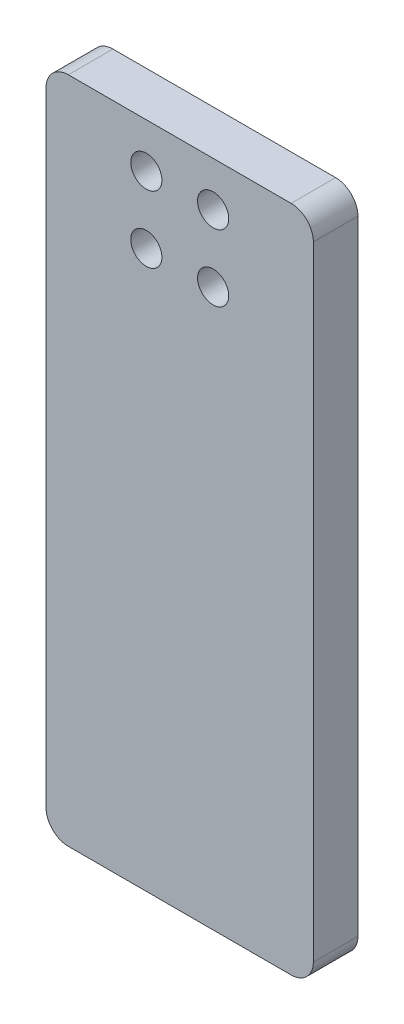
ISO-10303-21;
HEADER;
FILE_DESCRIPTION(('STEP AP214'),'2;1');
FILE_NAME('part.step','',(''),(''),'','','');
FILE_SCHEMA(('AUTOMOTIVE_DESIGN { 1 0 10303 214 1 1 1 1 }'));
ENDSEC;
DATA;
#1=APPLICATION_CONTEXT('core data for automotive mechanical design processes');
#2=APPLICATION_PROTOCOL_DEFINITION('international standard','automotive_design',2000,#1);
#3=PRODUCT_CONTEXT('',#1,'mechanical');
#4=PRODUCT('Part','Part','',(#3));
#5=PRODUCT_RELATED_PRODUCT_CATEGORY('part','',(#4));
#6=PRODUCT_DEFINITION_FORMATION('','',#4);
#7=PRODUCT_DEFINITION_CONTEXT('part definition',#1,'design');
#8=PRODUCT_DEFINITION('design','',#6,#7);
#9=PRODUCT_DEFINITION_SHAPE('','',#8);
#10=(LENGTH_UNIT() NAMED_UNIT(*) SI_UNIT(.MILLI.,.METRE.));
#11=(NAMED_UNIT(*) PLANE_ANGLE_UNIT() SI_UNIT($,.RADIAN.));
#12=(NAMED_UNIT(*) SI_UNIT($,.STERADIAN.) SOLID_ANGLE_UNIT());
#13=UNCERTAINTY_MEASURE_WITH_UNIT(LENGTH_MEASURE(1.E-05),#10,'distance_accuracy_value','');
#14=(GEOMETRIC_REPRESENTATION_CONTEXT(3) GLOBAL_UNCERTAINTY_ASSIGNED_CONTEXT((#13)) GLOBAL_UNIT_ASSIGNED_CONTEXT((#10,
#11,#12)) REPRESENTATION_CONTEXT('',''));
#15=CARTESIAN_POINT('',(0.,0.,0.));
#16=DIRECTION('',(0.,0.,1.));
#17=DIRECTION('',(1.,0.,0.));
#18=AXIS2_PLACEMENT_3D('',#15,#16,#17);
#19=CARTESIAN_POINT('',(30.,75.,-10.));
#20=DIRECTION('',(1.,0.,0.));
#21=DIRECTION('',(0.,1.,0.));
#22=AXIS2_PLACEMENT_3D('',#19,#20,#21);
#23=PLANE('',#22);
#24=DIRECTION('',(0.,1.,0.));
#25=VECTOR('',#24,1.);
#26=CARTESIAN_POINT('',(30.,75.,-10.));
#27=LINE('',#26,#25);
#28=CARTESIAN_POINT('',(30.,-70.,-10.));
#29=VERTEX_POINT('',#28);
#30=CARTESIAN_POINT('',(30.,70.,-10.));
#31=VERTEX_POINT('',#30);
#32=EDGE_CURVE('E162',#29,#31,#27,.T.);
#33=ORIENTED_EDGE('',*,*,#32,.T.);
#34=DIRECTION('',(0.,0.,1.));
#35=VECTOR('',#34,1.);
#36=CARTESIAN_POINT('',(30.,70.,-10.));
#37=LINE('',#36,#35);
#38=CARTESIAN_POINT('',(30.,70.,0.));
#39=VERTEX_POINT('',#38);
#40=EDGE_CURVE('E155',#31,#39,#37,.T.);
#41=ORIENTED_EDGE('',*,*,#40,.T.);
#42=DIRECTION('',(0.,1.,0.));
#43=VECTOR('',#42,1.);
#44=CARTESIAN_POINT('',(30.,75.,0.));
#45=LINE('',#44,#43);
#46=CARTESIAN_POINT('',(30.,-70.,0.));
#47=VERTEX_POINT('',#46);
#48=EDGE_CURVE('E108',#47,#39,#45,.T.);
#49=ORIENTED_EDGE('',*,*,#48,.F.);
#50=DIRECTION('',(0.,0.,1.));
#51=VECTOR('',#50,1.);
#52=CARTESIAN_POINT('',(30.,-70.,-10.));
#53=LINE('',#52,#51);
#54=EDGE_CURVE('E153',#47,#29,#53,.F.);
#55=ORIENTED_EDGE('',*,*,#54,.T.);
#56=EDGE_LOOP('',(#33,#41,#49,#55));
#57=FACE_BOUND('',#56,.T.);
#58=ADVANCED_FACE('F38',(#57),#23,.T.);
#59=CARTESIAN_POINT('',(-30.,-75.,-10.));
#60=DIRECTION('',(0.,-1.,0.));
#61=DIRECTION('',(0.,0.,-1.));
#62=AXIS2_PLACEMENT_3D('',#59,#60,#61);
#63=PLANE('',#62);
#64=DIRECTION('',(1.,0.,0.));
#65=VECTOR('',#64,1.);
#66=CARTESIAN_POINT('',(-30.,-75.,0.));
#67=LINE('',#66,#65);
#68=CARTESIAN_POINT('',(-25.,-75.,0.));
#69=VERTEX_POINT('',#68);
#70=CARTESIAN_POINT('',(25.,-75.,0.));
#71=VERTEX_POINT('',#70);
#72=EDGE_CURVE('E136',#69,#71,#67,.T.);
#73=ORIENTED_EDGE('',*,*,#72,.F.);
#74=DIRECTION('',(0.,0.,1.));
#75=VECTOR('',#74,1.);
#76=CARTESIAN_POINT('',(-25.,-75.,-10.));
#77=LINE('',#76,#75);
#78=CARTESIAN_POINT('',(-25.,-75.,-10.));
#79=VERTEX_POINT('',#78);
#80=EDGE_CURVE('E11',#69,#79,#77,.F.);
#81=ORIENTED_EDGE('',*,*,#80,.T.);
#82=DIRECTION('',(1.,0.,0.));
#83=VECTOR('',#82,1.);
#84=CARTESIAN_POINT('',(-30.,-75.,-10.));
#85=LINE('',#84,#83);
#86=CARTESIAN_POINT('',(25.,-75.,-10.));
#87=VERTEX_POINT('',#86);
#88=EDGE_CURVE('E129',#79,#87,#85,.T.);
#89=ORIENTED_EDGE('',*,*,#88,.T.);
#90=DIRECTION('',(0.,0.,1.));
#91=VECTOR('',#90,1.);
#92=CARTESIAN_POINT('',(25.,-75.,-10.));
#93=LINE('',#92,#91);
#94=EDGE_CURVE('E46',#87,#71,#93,.T.);
#95=ORIENTED_EDGE('',*,*,#94,.T.);
#96=EDGE_LOOP('',(#73,#81,#89,#95));
#97=FACE_BOUND('',#96,.T.);
#98=ADVANCED_FACE('F159',(#97),#63,.T.);
#99=CARTESIAN_POINT('',(-30.,75.,-10.));
#100=DIRECTION('',(-1.,0.,0.));
#101=DIRECTION('',(0.,-1.,0.));
#102=AXIS2_PLACEMENT_3D('',#99,#100,#101);
#103=PLANE('',#102);
#104=DIRECTION('',(0.,-1.,0.));
#105=VECTOR('',#104,1.);
#106=CARTESIAN_POINT('',(-30.,75.,0.));
#107=LINE('',#106,#105);
#108=CARTESIAN_POINT('',(-30.,70.,0.));
#109=VERTEX_POINT('',#108);
#110=CARTESIAN_POINT('',(-30.,-70.,0.));
#111=VERTEX_POINT('',#110);
#112=EDGE_CURVE('E124',#109,#111,#107,.T.);
#113=ORIENTED_EDGE('',*,*,#112,.F.);
#114=DIRECTION('',(0.,0.,1.));
#115=VECTOR('',#114,1.);
#116=CARTESIAN_POINT('',(-30.,70.,-10.));
#117=LINE('',#116,#115);
#118=CARTESIAN_POINT('',(-30.,70.,-10.));
#119=VERTEX_POINT('',#118);
#120=EDGE_CURVE('E145',#109,#119,#117,.F.);
#121=ORIENTED_EDGE('',*,*,#120,.T.);
#122=DIRECTION('',(0.,-1.,0.));
#123=VECTOR('',#122,1.);
#124=CARTESIAN_POINT('',(-30.,75.,-10.));
#125=LINE('',#124,#123);
#126=CARTESIAN_POINT('',(-30.,-70.,-10.));
#127=VERTEX_POINT('',#126);
#128=EDGE_CURVE('E133',#119,#127,#125,.T.);
#129=ORIENTED_EDGE('',*,*,#128,.T.);
#130=DIRECTION('',(0.,0.,1.));
#131=VECTOR('',#130,1.);
#132=CARTESIAN_POINT('',(-30.,-70.,-10.));
#133=LINE('',#132,#131);
#134=EDGE_CURVE('E142',#127,#111,#133,.T.);
#135=ORIENTED_EDGE('',*,*,#134,.T.);
#136=EDGE_LOOP('',(#113,#121,#129,#135));
#137=FACE_BOUND('',#136,.T.);
#138=ADVANCED_FACE('F224',(#137),#103,.T.);
#139=CARTESIAN_POINT('',(-30.,75.,-10.));
#140=DIRECTION('',(0.,1.,0.));
#141=DIRECTION('',(0.,0.,1.));
#142=AXIS2_PLACEMENT_3D('',#139,#140,#141);
#143=PLANE('',#142);
#144=DIRECTION('',(-1.,0.,0.));
#145=VECTOR('',#144,1.);
#146=CARTESIAN_POINT('',(-30.,75.,-10.));
#147=LINE('',#146,#145);
#148=CARTESIAN_POINT('',(25.,75.,-10.));
#149=VERTEX_POINT('',#148);
#150=CARTESIAN_POINT('',(-25.,75.,-10.));
#151=VERTEX_POINT('',#150);
#152=EDGE_CURVE('E164',#149,#151,#147,.T.);
#153=ORIENTED_EDGE('',*,*,#152,.T.);
#154=DIRECTION('',(0.,0.,1.));
#155=VECTOR('',#154,1.);
#156=CARTESIAN_POINT('',(-25.,75.,-10.));
#157=LINE('',#156,#155);
#158=CARTESIAN_POINT('',(-25.,75.,0.));
#159=VERTEX_POINT('',#158);
#160=EDGE_CURVE('E123',#151,#159,#157,.T.);
#161=ORIENTED_EDGE('',*,*,#160,.T.);
#162=DIRECTION('',(-1.,0.,0.));
#163=VECTOR('',#162,1.);
#164=CARTESIAN_POINT('',(-30.,75.,0.));
#165=LINE('',#164,#163);
#166=CARTESIAN_POINT('',(25.,75.,0.));
#167=VERTEX_POINT('',#166);
#168=EDGE_CURVE('E106',#167,#159,#165,.T.);
#169=ORIENTED_EDGE('',*,*,#168,.F.);
#170=DIRECTION('',(0.,0.,1.));
#171=VECTOR('',#170,1.);
#172=CARTESIAN_POINT('',(25.,75.,-10.));
#173=LINE('',#172,#171);
#174=EDGE_CURVE('E120',#167,#149,#173,.F.);
#175=ORIENTED_EDGE('',*,*,#174,.T.);
#176=EDGE_LOOP('',(#153,#161,#169,#175));
#177=FACE_BOUND('',#176,.T.);
#178=ADVANCED_FACE('F119',(#177),#143,.T.);
#179=CARTESIAN_POINT('',(0.,0.,-10.));
#180=DIRECTION('',(0.,0.,1.));
#181=DIRECTION('',(1.,0.,0.));
#182=AXIS2_PLACEMENT_3D('',#179,#180,#181);
#183=PLANE('',#182);
#184=CARTESIAN_POINT('',(-7.5,65.,-10.));
#185=DIRECTION('',(0.,0.,1.));
#186=DIRECTION('',(1.,0.,0.));
#187=AXIS2_PLACEMENT_3D('',#184,#185,#186);
#188=CIRCLE('',#187,3.5);
#189=CARTESIAN_POINT('',(-4.,65.,-10.));
#190=VERTEX_POINT('',#189);
#191=EDGE_CURVE('E168',#190,#190,#188,.T.);
#192=ORIENTED_EDGE('',*,*,#191,.T.);
#193=EDGE_LOOP('',(#192));
#194=FACE_BOUND('',#193,.T.);
#195=CARTESIAN_POINT('',(7.50000000000001,50.,-10.));
#196=DIRECTION('',(0.,0.,1.));
#197=DIRECTION('',(1.,0.,0.));
#198=AXIS2_PLACEMENT_3D('',#195,#196,#197);
#199=CIRCLE('',#198,3.5);
#200=CARTESIAN_POINT('',(11.,50.,-10.));
#201=VERTEX_POINT('',#200);
#202=EDGE_CURVE('E175',#201,#201,#199,.T.);
#203=ORIENTED_EDGE('',*,*,#202,.T.);
#204=EDGE_LOOP('',(#203));
#205=FACE_BOUND('',#204,.T.);
#206=CARTESIAN_POINT('',(-7.49999999999999,50.,-10.));
#207=DIRECTION('',(0.,0.,1.));
#208=DIRECTION('',(1.,0.,0.));
#209=AXIS2_PLACEMENT_3D('',#206,#207,#208);
#210=CIRCLE('',#209,3.5);
#211=CARTESIAN_POINT('',(-3.99999999999999,50.,-10.));
#212=VERTEX_POINT('',#211);
#213=EDGE_CURVE('E178',#212,#212,#210,.T.);
#214=ORIENTED_EDGE('',*,*,#213,.T.);
#215=EDGE_LOOP('',(#214));
#216=FACE_BOUND('',#215,.T.);
#217=CARTESIAN_POINT('',(7.5,65.,-10.));
#218=DIRECTION('',(0.,0.,1.));
#219=DIRECTION('',(1.,0.,0.));
#220=AXIS2_PLACEMENT_3D('',#217,#218,#219);
#221=CIRCLE('',#220,3.5);
#222=CARTESIAN_POINT('',(11.,65.,-10.));
#223=VERTEX_POINT('',#222);
#224=EDGE_CURVE('E181',#223,#223,#221,.T.);
#225=ORIENTED_EDGE('',*,*,#224,.T.);
#226=EDGE_LOOP('',(#225));
#227=FACE_BOUND('',#226,.T.);
#228=ORIENTED_EDGE('',*,*,#128,.F.);
#229=CARTESIAN_POINT('',(-25.,70.,-10.));
#230=DIRECTION('',(0.,0.,1.));
#231=DIRECTION('',(1.,0.,0.));
#232=AXIS2_PLACEMENT_3D('',#229,#230,#231);
#233=CIRCLE('',#232,5.);
#234=EDGE_CURVE('E151',#119,#151,#233,.F.);
#235=ORIENTED_EDGE('',*,*,#234,.T.);
#236=ORIENTED_EDGE('',*,*,#152,.F.);
#237=CARTESIAN_POINT('',(25.,70.,-10.));
#238=DIRECTION('',(0.,0.,1.));
#239=DIRECTION('',(1.,0.,0.));
#240=AXIS2_PLACEMENT_3D('',#237,#238,#239);
#241=CIRCLE('',#240,5.);
#242=EDGE_CURVE('E128',#149,#31,#241,.F.);
#243=ORIENTED_EDGE('',*,*,#242,.T.);
#244=ORIENTED_EDGE('',*,*,#32,.F.);
#245=CARTESIAN_POINT('',(25.,-70.,-10.));
#246=DIRECTION('',(0.,0.,1.));
#247=DIRECTION('',(1.,0.,0.));
#248=AXIS2_PLACEMENT_3D('',#245,#246,#247);
#249=CIRCLE('',#248,5.);
#250=EDGE_CURVE('E53',#29,#87,#249,.F.);
#251=ORIENTED_EDGE('',*,*,#250,.T.);
#252=ORIENTED_EDGE('',*,*,#88,.F.);
#253=CARTESIAN_POINT('',(-25.,-70.,-10.));
#254=DIRECTION('',(0.,0.,1.));
#255=DIRECTION('',(1.,0.,0.));
#256=AXIS2_PLACEMENT_3D('',#253,#254,#255);
#257=CIRCLE('',#256,5.);
#258=EDGE_CURVE('E148',#79,#127,#257,.F.);
#259=ORIENTED_EDGE('',*,*,#258,.T.);
#260=EDGE_LOOP('',(#228,#235,#236,#243,#244,#251,#252,#259));
#261=FACE_BOUND('',#260,.T.);
#262=ADVANCED_FACE('F203',(#194,#205,#216,#227,#261),#183,.F.);
#263=CARTESIAN_POINT('',(0.,0.,0.));
#264=DIRECTION('',(0.,0.,1.));
#265=DIRECTION('',(1.,0.,0.));
#266=AXIS2_PLACEMENT_3D('',#263,#264,#265);
#267=PLANE('',#266);
#268=CARTESIAN_POINT('',(-7.5,65.,0.));
#269=DIRECTION('',(0.,0.,1.));
#270=DIRECTION('',(1.,0.,0.));
#271=AXIS2_PLACEMENT_3D('',#268,#269,#270);
#272=CIRCLE('',#271,3.5);
#273=CARTESIAN_POINT('',(-4.,65.,0.));
#274=VERTEX_POINT('',#273);
#275=EDGE_CURVE('E187',#274,#274,#272,.T.);
#276=ORIENTED_EDGE('',*,*,#275,.F.);
#277=EDGE_LOOP('',(#276));
#278=FACE_BOUND('',#277,.T.);
#279=CARTESIAN_POINT('',(7.50000000000001,50.,0.));
#280=DIRECTION('',(0.,0.,1.));
#281=DIRECTION('',(1.,0.,0.));
#282=AXIS2_PLACEMENT_3D('',#279,#280,#281);
#283=CIRCLE('',#282,3.5);
#284=CARTESIAN_POINT('',(11.,50.,0.));
#285=VERTEX_POINT('',#284);
#286=EDGE_CURVE('E188',#285,#285,#283,.T.);
#287=ORIENTED_EDGE('',*,*,#286,.F.);
#288=EDGE_LOOP('',(#287));
#289=FACE_BOUND('',#288,.T.);
#290=CARTESIAN_POINT('',(-7.49999999999999,50.,0.));
#291=DIRECTION('',(0.,0.,1.));
#292=DIRECTION('',(1.,0.,0.));
#293=AXIS2_PLACEMENT_3D('',#290,#291,#292);
#294=CIRCLE('',#293,3.5);
#295=CARTESIAN_POINT('',(-3.99999999999999,50.,0.));
#296=VERTEX_POINT('',#295);
#297=EDGE_CURVE('E191',#296,#296,#294,.T.);
#298=ORIENTED_EDGE('',*,*,#297,.F.);
#299=EDGE_LOOP('',(#298));
#300=FACE_BOUND('',#299,.T.);
#301=CARTESIAN_POINT('',(7.5,65.,0.));
#302=DIRECTION('',(0.,0.,1.));
#303=DIRECTION('',(1.,0.,0.));
#304=AXIS2_PLACEMENT_3D('',#301,#302,#303);
#305=CIRCLE('',#304,3.5);
#306=CARTESIAN_POINT('',(11.,65.,0.));
#307=VERTEX_POINT('',#306);
#308=EDGE_CURVE('E184',#307,#307,#305,.T.);
#309=ORIENTED_EDGE('',*,*,#308,.F.);
#310=EDGE_LOOP('',(#309));
#311=FACE_BOUND('',#310,.T.);
#312=ORIENTED_EDGE('',*,*,#168,.T.);
#313=CARTESIAN_POINT('',(-25.,70.,0.));
#314=DIRECTION('',(0.,0.,1.));
#315=DIRECTION('',(1.,0.,0.));
#316=AXIS2_PLACEMENT_3D('',#313,#314,#315);
#317=CIRCLE('',#316,5.);
#318=EDGE_CURVE('E113',#159,#109,#317,.T.);
#319=ORIENTED_EDGE('',*,*,#318,.T.);
#320=ORIENTED_EDGE('',*,*,#112,.T.);
#321=CARTESIAN_POINT('',(-25.,-70.,0.));
#322=DIRECTION('',(0.,0.,1.));
#323=DIRECTION('',(1.,0.,0.));
#324=AXIS2_PLACEMENT_3D('',#321,#322,#323);
#325=CIRCLE('',#324,5.);
#326=EDGE_CURVE('E114',#111,#69,#325,.T.);
#327=ORIENTED_EDGE('',*,*,#326,.T.);
#328=ORIENTED_EDGE('',*,*,#72,.T.);
#329=CARTESIAN_POINT('',(25.,-70.,0.));
#330=DIRECTION('',(0.,0.,1.));
#331=DIRECTION('',(1.,0.,0.));
#332=AXIS2_PLACEMENT_3D('',#329,#330,#331);
#333=CIRCLE('',#332,5.);
#334=EDGE_CURVE('E131',#71,#47,#333,.T.);
#335=ORIENTED_EDGE('',*,*,#334,.T.);
#336=ORIENTED_EDGE('',*,*,#48,.T.);
#337=CARTESIAN_POINT('',(25.,70.,0.));
#338=DIRECTION('',(0.,0.,1.));
#339=DIRECTION('',(1.,0.,0.));
#340=AXIS2_PLACEMENT_3D('',#337,#338,#339);
#341=CIRCLE('',#340,5.);
#342=EDGE_CURVE('E103',#39,#167,#341,.T.);
#343=ORIENTED_EDGE('',*,*,#342,.T.);
#344=EDGE_LOOP('',(#312,#319,#320,#327,#328,#335,#336,#343));
#345=FACE_BOUND('',#344,.T.);
#346=ADVANCED_FACE('F105',(#278,#289,#300,#311,#345),#267,.T.);
#347=CARTESIAN_POINT('',(7.5,65.,-26.));
#348=DIRECTION('',(0.,0.,1.));
#349=DIRECTION('',(1.,0.,0.));
#350=AXIS2_PLACEMENT_3D('',#347,#348,#349);
#351=CYLINDRICAL_SURFACE('',#350,3.5);
#352=CARTESIAN_POINT('',(11.,65.,0.));
#353=CARTESIAN_POINT('',(11.,65.,-0.10416666666667));
#354=CARTESIAN_POINT('',(11.,65.,-0.208333333333337));
#355=CARTESIAN_POINT('',(11.,65.,-0.416666666666671));
#356=CARTESIAN_POINT('',(11.,65.,-0.520833333333337));
#357=CARTESIAN_POINT('',(11.,65.,-0.729166666666671));
#358=CARTESIAN_POINT('',(11.,65.,-0.833333333333337));
#359=CARTESIAN_POINT('',(11.,65.,-1.04166666666667));
#360=CARTESIAN_POINT('',(11.,65.,-1.14583333333334));
#361=CARTESIAN_POINT('',(11.,65.,-1.35416666666667));
#362=CARTESIAN_POINT('',(11.,65.,-1.45833333333334));
#363=CARTESIAN_POINT('',(11.,65.,-1.66666666666667));
#364=CARTESIAN_POINT('',(11.,65.,-1.77083333333334));
#365=CARTESIAN_POINT('',(11.,65.,-1.97916666666667));
#366=CARTESIAN_POINT('',(11.,65.,-2.08333333333334));
#367=CARTESIAN_POINT('',(11.,65.,-2.29166666666667));
#368=CARTESIAN_POINT('',(11.,65.,-2.39583333333334));
#369=CARTESIAN_POINT('',(11.,65.,-2.60416666666667));
#370=CARTESIAN_POINT('',(11.,65.,-2.70833333333334));
#371=CARTESIAN_POINT('',(11.,65.,-2.91666666666667));
#372=CARTESIAN_POINT('',(11.,65.,-3.02083333333334));
#373=CARTESIAN_POINT('',(11.,65.,-3.22916666666667));
#374=CARTESIAN_POINT('',(11.,65.,-3.33333333333334));
#375=CARTESIAN_POINT('',(11.,65.,-3.54166666666667));
#376=CARTESIAN_POINT('',(11.,65.,-3.64583333333334));
#377=CARTESIAN_POINT('',(11.,65.,-3.85416666666667));
#378=CARTESIAN_POINT('',(11.,65.,-3.95833333333334));
#379=CARTESIAN_POINT('',(11.,65.,-4.16666666666667));
#380=CARTESIAN_POINT('',(11.,65.,-4.27083333333334));
#381=CARTESIAN_POINT('',(11.,65.,-4.47916666666667));
#382=CARTESIAN_POINT('',(11.,65.,-4.58333333333334));
#383=CARTESIAN_POINT('',(11.,65.,-4.79166666666667));
#384=CARTESIAN_POINT('',(11.,65.,-4.89583333333334));
#385=CARTESIAN_POINT('',(11.,65.,-5.10416666666667));
#386=CARTESIAN_POINT('',(11.,65.,-5.20833333333334));
#387=CARTESIAN_POINT('',(11.,65.,-5.41666666666667));
#388=CARTESIAN_POINT('',(11.,65.,-5.52083333333334));
#389=CARTESIAN_POINT('',(11.,65.,-5.72916666666667));
#390=CARTESIAN_POINT('',(11.,65.,-5.83333333333334));
#391=CARTESIAN_POINT('',(11.,65.,-6.04166666666667));
#392=CARTESIAN_POINT('',(11.,65.,-6.14583333333334));
#393=CARTESIAN_POINT('',(11.,65.,-6.35416666666667));
#394=CARTESIAN_POINT('',(11.,65.,-6.45833333333334));
#395=CARTESIAN_POINT('',(11.,65.,-6.66666666666667));
#396=CARTESIAN_POINT('',(11.,65.,-6.77083333333334));
#397=CARTESIAN_POINT('',(11.,65.,-6.97916666666667));
#398=CARTESIAN_POINT('',(11.,65.,-7.08333333333334));
#399=CARTESIAN_POINT('',(11.,65.,-7.29166666666667));
#400=CARTESIAN_POINT('',(11.,65.,-7.39583333333334));
#401=CARTESIAN_POINT('',(11.,65.,-7.60416666666667));
#402=CARTESIAN_POINT('',(11.,65.,-7.70833333333334));
#403=CARTESIAN_POINT('',(11.,65.,-7.91666666666667));
#404=CARTESIAN_POINT('',(11.,65.,-8.02083333333334));
#405=CARTESIAN_POINT('',(11.,65.,-8.22916666666667));
#406=CARTESIAN_POINT('',(11.,65.,-8.33333333333334));
#407=CARTESIAN_POINT('',(11.,65.,-8.54166666666667));
#408=CARTESIAN_POINT('',(11.,65.,-8.64583333333334));
#409=CARTESIAN_POINT('',(11.,65.,-8.85416666666667));
#410=CARTESIAN_POINT('',(11.,65.,-8.95833333333334));
#411=CARTESIAN_POINT('',(11.,65.,-9.16666666666667));
#412=CARTESIAN_POINT('',(11.,65.,-9.27083333333334));
#413=CARTESIAN_POINT('',(11.,65.,-9.47916666666667));
#414=CARTESIAN_POINT('',(11.,65.,-9.58333333333334));
#415=CARTESIAN_POINT('',(11.,65.,-9.79166666666667));
#416=CARTESIAN_POINT('',(11.,65.,-9.89583333333334));
#417=CARTESIAN_POINT('',(11.,65.,-10.));
#418=B_SPLINE_CURVE_WITH_KNOTS('',3,(#352,#353,#354,#355,#356,#357,#358,#359,#360,#361,#362,
#363,#364,#365,#366,#367,#368,#369,#370,#371,#372,#373,#374,#375,#376,#377,#378,#379,#380,#381,
#382,#383,#384,#385,#386,#387,#388,#389,#390,#391,#392,#393,#394,#395,#396,#397,#398,#399,#400,
#401,#402,#403,#404,#405,#406,#407,#408,#409,#410,#411,#412,#413,#414,#415,#416,#417),
.UNSPECIFIED.,.F.,.F.,(4,2,2,2,2,2,2,2,2,2,2,2,2,2,2,2,2,2,2,2,2,2,2,2,2,2,2,2,2,2,2,2,4),(0.,
0.3125,0.625000000000001,0.937500000000001,1.25,1.5625,1.875,2.1875,2.5,2.8125,3.125,3.4375,
3.75,4.0625,4.375,4.6875,5.,5.3125,5.625,5.9375,6.25,6.5625,6.875,7.1875,7.5,7.8125,8.125,
8.4375,8.75,9.0625,9.375,9.6875,10.),.UNSPECIFIED.);
#419=EDGE_CURVE('BSEAM202',#307,#223,#418,.T.);
#420=ORIENTED_EDGE('',*,*,#308,.T.);
#421=ORIENTED_EDGE('',*,*,#224,.F.);
#422=ORIENTED_EDGE('',*,*,#419,.T.);
#423=ORIENTED_EDGE('',*,*,#419,.F.);
#424=EDGE_LOOP('',(#420,#422,#421,#423));
#425=FACE_BOUND('',#424,.T.);
#426=ADVANCED_FACE('F202',(#425),#351,.F.);
#427=CARTESIAN_POINT('',(-7.49999999999999,50.,-26.));
#428=DIRECTION('',(0.,0.,1.));
#429=DIRECTION('',(1.,0.,0.));
#430=AXIS2_PLACEMENT_3D('',#427,#428,#429);
#431=CYLINDRICAL_SURFACE('',#430,3.5);
#432=CARTESIAN_POINT('',(-3.99999999999999,50.,0.));
#433=CARTESIAN_POINT('',(-3.99999999999999,50.,-0.10416666666667));
#434=CARTESIAN_POINT('',(-3.99999999999999,50.,-0.208333333333337));
#435=CARTESIAN_POINT('',(-3.99999999999999,50.,-0.416666666666671));
#436=CARTESIAN_POINT('',(-3.99999999999999,50.,-0.520833333333337));
#437=CARTESIAN_POINT('',(-3.99999999999999,50.,-0.729166666666671));
#438=CARTESIAN_POINT('',(-3.99999999999999,50.,-0.833333333333337));
#439=CARTESIAN_POINT('',(-3.99999999999999,50.,-1.04166666666667));
#440=CARTESIAN_POINT('',(-3.99999999999999,50.,-1.14583333333334));
#441=CARTESIAN_POINT('',(-3.99999999999999,50.,-1.35416666666667));
#442=CARTESIAN_POINT('',(-3.99999999999999,50.,-1.45833333333334));
#443=CARTESIAN_POINT('',(-3.99999999999999,50.,-1.66666666666667));
#444=CARTESIAN_POINT('',(-3.99999999999999,50.,-1.77083333333334));
#445=CARTESIAN_POINT('',(-3.99999999999999,50.,-1.97916666666667));
#446=CARTESIAN_POINT('',(-3.99999999999999,50.,-2.08333333333334));
#447=CARTESIAN_POINT('',(-3.99999999999999,50.,-2.29166666666667));
#448=CARTESIAN_POINT('',(-3.99999999999999,50.,-2.39583333333334));
#449=CARTESIAN_POINT('',(-3.99999999999999,50.,-2.60416666666667));
#450=CARTESIAN_POINT('',(-3.99999999999999,50.,-2.70833333333334));
#451=CARTESIAN_POINT('',(-3.99999999999999,50.,-2.91666666666667));
#452=CARTESIAN_POINT('',(-3.99999999999999,50.,-3.02083333333334));
#453=CARTESIAN_POINT('',(-3.99999999999999,50.,-3.22916666666667));
#454=CARTESIAN_POINT('',(-3.99999999999999,50.,-3.33333333333334));
#455=CARTESIAN_POINT('',(-3.99999999999999,50.,-3.54166666666667));
#456=CARTESIAN_POINT('',(-3.99999999999999,50.,-3.64583333333334));
#457=CARTESIAN_POINT('',(-3.99999999999999,50.,-3.85416666666667));
#458=CARTESIAN_POINT('',(-3.99999999999999,50.,-3.95833333333334));
#459=CARTESIAN_POINT('',(-3.99999999999999,50.,-4.16666666666667));
#460=CARTESIAN_POINT('',(-3.99999999999999,50.,-4.27083333333334));
#461=CARTESIAN_POINT('',(-3.99999999999999,50.,-4.47916666666667));
#462=CARTESIAN_POINT('',(-3.99999999999999,50.,-4.58333333333334));
#463=CARTESIAN_POINT('',(-3.99999999999999,50.,-4.79166666666667));
#464=CARTESIAN_POINT('',(-3.99999999999999,50.,-4.89583333333334));
#465=CARTESIAN_POINT('',(-3.99999999999999,50.,-5.10416666666667));
#466=CARTESIAN_POINT('',(-3.99999999999999,50.,-5.20833333333334));
#467=CARTESIAN_POINT('',(-3.99999999999999,50.,-5.41666666666667));
#468=CARTESIAN_POINT('',(-3.99999999999999,50.,-5.52083333333334));
#469=CARTESIAN_POINT('',(-3.99999999999999,50.,-5.72916666666667));
#470=CARTESIAN_POINT('',(-3.99999999999999,50.,-5.83333333333334));
#471=CARTESIAN_POINT('',(-3.99999999999999,50.,-6.04166666666667));
#472=CARTESIAN_POINT('',(-3.99999999999999,50.,-6.14583333333334));
#473=CARTESIAN_POINT('',(-3.99999999999999,50.,-6.35416666666667));
#474=CARTESIAN_POINT('',(-3.99999999999999,50.,-6.45833333333334));
#475=CARTESIAN_POINT('',(-3.99999999999999,50.,-6.66666666666667));
#476=CARTESIAN_POINT('',(-3.99999999999999,50.,-6.77083333333334));
#477=CARTESIAN_POINT('',(-3.99999999999999,50.,-6.97916666666667));
#478=CARTESIAN_POINT('',(-3.99999999999999,50.,-7.08333333333334));
#479=CARTESIAN_POINT('',(-3.99999999999999,50.,-7.29166666666667));
#480=CARTESIAN_POINT('',(-3.99999999999999,50.,-7.39583333333334));
#481=CARTESIAN_POINT('',(-3.99999999999999,50.,-7.60416666666667));
#482=CARTESIAN_POINT('',(-3.99999999999999,50.,-7.70833333333334));
#483=CARTESIAN_POINT('',(-3.99999999999999,50.,-7.91666666666667));
#484=CARTESIAN_POINT('',(-3.99999999999999,50.,-8.02083333333334));
#485=CARTESIAN_POINT('',(-3.99999999999999,50.,-8.22916666666667));
#486=CARTESIAN_POINT('',(-3.99999999999999,50.,-8.33333333333334));
#487=CARTESIAN_POINT('',(-3.99999999999999,50.,-8.54166666666667));
#488=CARTESIAN_POINT('',(-3.99999999999999,50.,-8.64583333333334));
#489=CARTESIAN_POINT('',(-3.99999999999999,50.,-8.85416666666667));
#490=CARTESIAN_POINT('',(-3.99999999999999,50.,-8.95833333333334));
#491=CARTESIAN_POINT('',(-3.99999999999999,50.,-9.16666666666667));
#492=CARTESIAN_POINT('',(-3.99999999999999,50.,-9.27083333333334));
#493=CARTESIAN_POINT('',(-3.99999999999999,50.,-9.47916666666667));
#494=CARTESIAN_POINT('',(-3.99999999999999,50.,-9.58333333333334));
#495=CARTESIAN_POINT('',(-3.99999999999999,50.,-9.79166666666667));
#496=CARTESIAN_POINT('',(-3.99999999999999,50.,-9.89583333333334));
#497=CARTESIAN_POINT('',(-3.99999999999999,50.,-10.));
#498=B_SPLINE_CURVE_WITH_KNOTS('',3,(#432,#433,#434,#435,#436,#437,#438,#439,#440,#441,#442,
#443,#444,#445,#446,#447,#448,#449,#450,#451,#452,#453,#454,#455,#456,#457,#458,#459,#460,#461,
#462,#463,#464,#465,#466,#467,#468,#469,#470,#471,#472,#473,#474,#475,#476,#477,#478,#479,#480,
#481,#482,#483,#484,#485,#486,#487,#488,#489,#490,#491,#492,#493,#494,#495,#496,#497),
.UNSPECIFIED.,.F.,.F.,(4,2,2,2,2,2,2,2,2,2,2,2,2,2,2,2,2,2,2,2,2,2,2,2,2,2,2,2,2,2,2,2,4),(0.,
0.3125,0.625000000000001,0.937500000000001,1.25,1.5625,1.875,2.1875,2.5,2.8125,3.125,3.4375,
3.75,4.0625,4.375,4.6875,5.,5.3125,5.625,5.9375,6.25,6.5625,6.875,7.1875,7.5,7.8125,8.125,
8.4375,8.75,9.0625,9.375,9.6875,10.),.UNSPECIFIED.);
#499=EDGE_CURVE('BSEAM197',#296,#212,#498,.T.);
#500=ORIENTED_EDGE('',*,*,#297,.T.);
#501=ORIENTED_EDGE('',*,*,#213,.F.);
#502=ORIENTED_EDGE('',*,*,#499,.T.);
#503=ORIENTED_EDGE('',*,*,#499,.F.);
#504=EDGE_LOOP('',(#500,#502,#501,#503));
#505=FACE_BOUND('',#504,.T.);
#506=ADVANCED_FACE('F197',(#505),#431,.F.);
#507=CARTESIAN_POINT('',(7.50000000000001,50.,-26.));
#508=DIRECTION('',(0.,0.,1.));
#509=DIRECTION('',(1.,0.,0.));
#510=AXIS2_PLACEMENT_3D('',#507,#508,#509);
#511=CYLINDRICAL_SURFACE('',#510,3.5);
#512=CARTESIAN_POINT('',(11.,50.,0.));
#513=CARTESIAN_POINT('',(11.,50.,-0.10416666666667));
#514=CARTESIAN_POINT('',(11.,50.,-0.208333333333337));
#515=CARTESIAN_POINT('',(11.,50.,-0.416666666666671));
#516=CARTESIAN_POINT('',(11.,50.,-0.520833333333337));
#517=CARTESIAN_POINT('',(11.,50.,-0.729166666666671));
#518=CARTESIAN_POINT('',(11.,50.,-0.833333333333337));
#519=CARTESIAN_POINT('',(11.,50.,-1.04166666666667));
#520=CARTESIAN_POINT('',(11.,50.,-1.14583333333334));
#521=CARTESIAN_POINT('',(11.,50.,-1.35416666666667));
#522=CARTESIAN_POINT('',(11.,50.,-1.45833333333334));
#523=CARTESIAN_POINT('',(11.,50.,-1.66666666666667));
#524=CARTESIAN_POINT('',(11.,50.,-1.77083333333334));
#525=CARTESIAN_POINT('',(11.,50.,-1.97916666666667));
#526=CARTESIAN_POINT('',(11.,50.,-2.08333333333334));
#527=CARTESIAN_POINT('',(11.,50.,-2.29166666666667));
#528=CARTESIAN_POINT('',(11.,50.,-2.39583333333334));
#529=CARTESIAN_POINT('',(11.,50.,-2.60416666666667));
#530=CARTESIAN_POINT('',(11.,50.,-2.70833333333334));
#531=CARTESIAN_POINT('',(11.,50.,-2.91666666666667));
#532=CARTESIAN_POINT('',(11.,50.,-3.02083333333334));
#533=CARTESIAN_POINT('',(11.,50.,-3.22916666666667));
#534=CARTESIAN_POINT('',(11.,50.,-3.33333333333334));
#535=CARTESIAN_POINT('',(11.,50.,-3.54166666666667));
#536=CARTESIAN_POINT('',(11.,50.,-3.64583333333334));
#537=CARTESIAN_POINT('',(11.,50.,-3.85416666666667));
#538=CARTESIAN_POINT('',(11.,50.,-3.95833333333334));
#539=CARTESIAN_POINT('',(11.,50.,-4.16666666666667));
#540=CARTESIAN_POINT('',(11.,50.,-4.27083333333334));
#541=CARTESIAN_POINT('',(11.,50.,-4.47916666666667));
#542=CARTESIAN_POINT('',(11.,50.,-4.58333333333334));
#543=CARTESIAN_POINT('',(11.,50.,-4.79166666666667));
#544=CARTESIAN_POINT('',(11.,50.,-4.89583333333334));
#545=CARTESIAN_POINT('',(11.,50.,-5.10416666666667));
#546=CARTESIAN_POINT('',(11.,50.,-5.20833333333334));
#547=CARTESIAN_POINT('',(11.,50.,-5.41666666666667));
#548=CARTESIAN_POINT('',(11.,50.,-5.52083333333334));
#549=CARTESIAN_POINT('',(11.,50.,-5.72916666666667));
#550=CARTESIAN_POINT('',(11.,50.,-5.83333333333334));
#551=CARTESIAN_POINT('',(11.,50.,-6.04166666666667));
#552=CARTESIAN_POINT('',(11.,50.,-6.14583333333334));
#553=CARTESIAN_POINT('',(11.,50.,-6.35416666666667));
#554=CARTESIAN_POINT('',(11.,50.,-6.45833333333334));
#555=CARTESIAN_POINT('',(11.,50.,-6.66666666666667));
#556=CARTESIAN_POINT('',(11.,50.,-6.77083333333334));
#557=CARTESIAN_POINT('',(11.,50.,-6.97916666666667));
#558=CARTESIAN_POINT('',(11.,50.,-7.08333333333334));
#559=CARTESIAN_POINT('',(11.,50.,-7.29166666666667));
#560=CARTESIAN_POINT('',(11.,50.,-7.39583333333334));
#561=CARTESIAN_POINT('',(11.,50.,-7.60416666666667));
#562=CARTESIAN_POINT('',(11.,50.,-7.70833333333334));
#563=CARTESIAN_POINT('',(11.,50.,-7.91666666666667));
#564=CARTESIAN_POINT('',(11.,50.,-8.02083333333334));
#565=CARTESIAN_POINT('',(11.,50.,-8.22916666666667));
#566=CARTESIAN_POINT('',(11.,50.,-8.33333333333334));
#567=CARTESIAN_POINT('',(11.,50.,-8.54166666666667));
#568=CARTESIAN_POINT('',(11.,50.,-8.64583333333334));
#569=CARTESIAN_POINT('',(11.,50.,-8.85416666666667));
#570=CARTESIAN_POINT('',(11.,50.,-8.95833333333334));
#571=CARTESIAN_POINT('',(11.,50.,-9.16666666666667));
#572=CARTESIAN_POINT('',(11.,50.,-9.27083333333334));
#573=CARTESIAN_POINT('',(11.,50.,-9.47916666666667));
#574=CARTESIAN_POINT('',(11.,50.,-9.58333333333334));
#575=CARTESIAN_POINT('',(11.,50.,-9.79166666666667));
#576=CARTESIAN_POINT('',(11.,50.,-9.89583333333334));
#577=CARTESIAN_POINT('',(11.,50.,-10.));
#578=B_SPLINE_CURVE_WITH_KNOTS('',3,(#512,#513,#514,#515,#516,#517,#518,#519,#520,#521,#522,
#523,#524,#525,#526,#527,#528,#529,#530,#531,#532,#533,#534,#535,#536,#537,#538,#539,#540,#541,
#542,#543,#544,#545,#546,#547,#548,#549,#550,#551,#552,#553,#554,#555,#556,#557,#558,#559,#560,
#561,#562,#563,#564,#565,#566,#567,#568,#569,#570,#571,#572,#573,#574,#575,#576,#577),
.UNSPECIFIED.,.F.,.F.,(4,2,2,2,2,2,2,2,2,2,2,2,2,2,2,2,2,2,2,2,2,2,2,2,2,2,2,2,2,2,2,2,4),(0.,
0.3125,0.625000000000001,0.937500000000001,1.25,1.5625,1.875,2.1875,2.5,2.8125,3.125,3.4375,
3.75,4.0625,4.375,4.6875,5.,5.3125,5.625,5.9375,6.25,6.5625,6.875,7.1875,7.5,7.8125,8.125,
8.4375,8.75,9.0625,9.375,9.6875,10.),.UNSPECIFIED.);
#579=EDGE_CURVE('BSEAM248',#285,#201,#578,.T.);
#580=ORIENTED_EDGE('',*,*,#286,.T.);
#581=ORIENTED_EDGE('',*,*,#202,.F.);
#582=ORIENTED_EDGE('',*,*,#579,.T.);
#583=ORIENTED_EDGE('',*,*,#579,.F.);
#584=EDGE_LOOP('',(#580,#582,#581,#583));
#585=FACE_BOUND('',#584,.T.);
#586=ADVANCED_FACE('F248',(#585),#511,.F.);
#587=CARTESIAN_POINT('',(-7.5,65.,-26.));
#588=DIRECTION('',(0.,0.,1.));
#589=DIRECTION('',(1.,0.,0.));
#590=AXIS2_PLACEMENT_3D('',#587,#588,#589);
#591=CYLINDRICAL_SURFACE('',#590,3.5);
#592=CARTESIAN_POINT('',(-4.,65.,0.));
#593=CARTESIAN_POINT('',(-4.,65.,-0.10416666666667));
#594=CARTESIAN_POINT('',(-4.,65.,-0.208333333333337));
#595=CARTESIAN_POINT('',(-4.,65.,-0.416666666666671));
#596=CARTESIAN_POINT('',(-4.,65.,-0.520833333333337));
#597=CARTESIAN_POINT('',(-4.,65.,-0.729166666666671));
#598=CARTESIAN_POINT('',(-4.,65.,-0.833333333333337));
#599=CARTESIAN_POINT('',(-4.,65.,-1.04166666666667));
#600=CARTESIAN_POINT('',(-4.,65.,-1.14583333333334));
#601=CARTESIAN_POINT('',(-4.,65.,-1.35416666666667));
#602=CARTESIAN_POINT('',(-4.,65.,-1.45833333333334));
#603=CARTESIAN_POINT('',(-4.,65.,-1.66666666666667));
#604=CARTESIAN_POINT('',(-4.,65.,-1.77083333333334));
#605=CARTESIAN_POINT('',(-4.,65.,-1.97916666666667));
#606=CARTESIAN_POINT('',(-4.,65.,-2.08333333333334));
#607=CARTESIAN_POINT('',(-4.,65.,-2.29166666666667));
#608=CARTESIAN_POINT('',(-4.,65.,-2.39583333333334));
#609=CARTESIAN_POINT('',(-4.,65.,-2.60416666666667));
#610=CARTESIAN_POINT('',(-4.,65.,-2.70833333333334));
#611=CARTESIAN_POINT('',(-4.,65.,-2.91666666666667));
#612=CARTESIAN_POINT('',(-4.,65.,-3.02083333333334));
#613=CARTESIAN_POINT('',(-4.,65.,-3.22916666666667));
#614=CARTESIAN_POINT('',(-4.,65.,-3.33333333333334));
#615=CARTESIAN_POINT('',(-4.,65.,-3.54166666666667));
#616=CARTESIAN_POINT('',(-4.,65.,-3.64583333333334));
#617=CARTESIAN_POINT('',(-4.,65.,-3.85416666666667));
#618=CARTESIAN_POINT('',(-4.,65.,-3.95833333333334));
#619=CARTESIAN_POINT('',(-4.,65.,-4.16666666666667));
#620=CARTESIAN_POINT('',(-4.,65.,-4.27083333333334));
#621=CARTESIAN_POINT('',(-4.,65.,-4.47916666666667));
#622=CARTESIAN_POINT('',(-4.,65.,-4.58333333333334));
#623=CARTESIAN_POINT('',(-4.,65.,-4.79166666666667));
#624=CARTESIAN_POINT('',(-4.,65.,-4.89583333333334));
#625=CARTESIAN_POINT('',(-4.,65.,-5.10416666666667));
#626=CARTESIAN_POINT('',(-4.,65.,-5.20833333333334));
#627=CARTESIAN_POINT('',(-4.,65.,-5.41666666666667));
#628=CARTESIAN_POINT('',(-4.,65.,-5.52083333333334));
#629=CARTESIAN_POINT('',(-4.,65.,-5.72916666666667));
#630=CARTESIAN_POINT('',(-4.,65.,-5.83333333333334));
#631=CARTESIAN_POINT('',(-4.,65.,-6.04166666666667));
#632=CARTESIAN_POINT('',(-4.,65.,-6.14583333333334));
#633=CARTESIAN_POINT('',(-4.,65.,-6.35416666666667));
#634=CARTESIAN_POINT('',(-4.,65.,-6.45833333333334));
#635=CARTESIAN_POINT('',(-4.,65.,-6.66666666666667));
#636=CARTESIAN_POINT('',(-4.,65.,-6.77083333333334));
#637=CARTESIAN_POINT('',(-4.,65.,-6.97916666666667));
#638=CARTESIAN_POINT('',(-4.,65.,-7.08333333333334));
#639=CARTESIAN_POINT('',(-4.,65.,-7.29166666666667));
#640=CARTESIAN_POINT('',(-4.,65.,-7.39583333333334));
#641=CARTESIAN_POINT('',(-4.,65.,-7.60416666666667));
#642=CARTESIAN_POINT('',(-4.,65.,-7.70833333333334));
#643=CARTESIAN_POINT('',(-4.,65.,-7.91666666666667));
#644=CARTESIAN_POINT('',(-4.,65.,-8.02083333333334));
#645=CARTESIAN_POINT('',(-4.,65.,-8.22916666666667));
#646=CARTESIAN_POINT('',(-4.,65.,-8.33333333333334));
#647=CARTESIAN_POINT('',(-4.,65.,-8.54166666666667));
#648=CARTESIAN_POINT('',(-4.,65.,-8.64583333333334));
#649=CARTESIAN_POINT('',(-4.,65.,-8.85416666666667));
#650=CARTESIAN_POINT('',(-4.,65.,-8.95833333333334));
#651=CARTESIAN_POINT('',(-4.,65.,-9.16666666666667));
#652=CARTESIAN_POINT('',(-4.,65.,-9.27083333333334));
#653=CARTESIAN_POINT('',(-4.,65.,-9.47916666666667));
#654=CARTESIAN_POINT('',(-4.,65.,-9.58333333333334));
#655=CARTESIAN_POINT('',(-4.,65.,-9.79166666666667));
#656=CARTESIAN_POINT('',(-4.,65.,-9.89583333333334));
#657=CARTESIAN_POINT('',(-4.,65.,-10.));
#658=B_SPLINE_CURVE_WITH_KNOTS('',3,(#592,#593,#594,#595,#596,#597,#598,#599,#600,#601,#602,
#603,#604,#605,#606,#607,#608,#609,#610,#611,#612,#613,#614,#615,#616,#617,#618,#619,#620,#621,
#622,#623,#624,#625,#626,#627,#628,#629,#630,#631,#632,#633,#634,#635,#636,#637,#638,#639,#640,
#641,#642,#643,#644,#645,#646,#647,#648,#649,#650,#651,#652,#653,#654,#655,#656,#657),
.UNSPECIFIED.,.F.,.F.,(4,2,2,2,2,2,2,2,2,2,2,2,2,2,2,2,2,2,2,2,2,2,2,2,2,2,2,2,2,2,2,2,4),(0.,
0.3125,0.625000000000001,0.937500000000001,1.25,1.5625,1.875,2.1875,2.5,2.8125,3.125,3.4375,
3.75,4.0625,4.375,4.6875,5.,5.3125,5.625,5.9375,6.25,6.5625,6.875,7.1875,7.5,7.8125,8.125,
8.4375,8.75,9.0625,9.375,9.6875,10.),.UNSPECIFIED.);
#659=EDGE_CURVE('BSEAM244',#274,#190,#658,.T.);
#660=ORIENTED_EDGE('',*,*,#275,.T.);
#661=ORIENTED_EDGE('',*,*,#191,.F.);
#662=ORIENTED_EDGE('',*,*,#659,.T.);
#663=ORIENTED_EDGE('',*,*,#659,.F.);
#664=EDGE_LOOP('',(#660,#662,#661,#663));
#665=FACE_BOUND('',#664,.T.);
#666=ADVANCED_FACE('F244',(#665),#591,.F.);
#667=CARTESIAN_POINT('',(-25.,70.,-10.));
#668=DIRECTION('',(0.,0.,1.));
#669=DIRECTION('',(1.,0.,0.));
#670=AXIS2_PLACEMENT_3D('',#667,#668,#669);
#671=CYLINDRICAL_SURFACE('',#670,5.);
#672=ORIENTED_EDGE('',*,*,#234,.F.);
#673=ORIENTED_EDGE('',*,*,#120,.F.);
#674=ORIENTED_EDGE('',*,*,#318,.F.);
#675=ORIENTED_EDGE('',*,*,#160,.F.);
#676=EDGE_LOOP('',(#672,#673,#674,#675));
#677=FACE_BOUND('',#676,.T.);
#678=ADVANCED_FACE('F223',(#677),#671,.T.);
#679=CARTESIAN_POINT('',(25.,70.,-10.));
#680=DIRECTION('',(0.,0.,1.));
#681=DIRECTION('',(1.,0.,0.));
#682=AXIS2_PLACEMENT_3D('',#679,#680,#681);
#683=CYLINDRICAL_SURFACE('',#682,5.);
#684=ORIENTED_EDGE('',*,*,#242,.F.);
#685=ORIENTED_EDGE('',*,*,#174,.F.);
#686=ORIENTED_EDGE('',*,*,#342,.F.);
#687=ORIENTED_EDGE('',*,*,#40,.F.);
#688=EDGE_LOOP('',(#684,#685,#686,#687));
#689=FACE_BOUND('',#688,.T.);
#690=ADVANCED_FACE('F127',(#689),#683,.T.);
#691=CARTESIAN_POINT('',(-25.,-70.,-10.));
#692=DIRECTION('',(0.,0.,1.));
#693=DIRECTION('',(1.,0.,0.));
#694=AXIS2_PLACEMENT_3D('',#691,#692,#693);
#695=CYLINDRICAL_SURFACE('',#694,5.);
#696=ORIENTED_EDGE('',*,*,#258,.F.);
#697=ORIENTED_EDGE('',*,*,#80,.F.);
#698=ORIENTED_EDGE('',*,*,#326,.F.);
#699=ORIENTED_EDGE('',*,*,#134,.F.);
#700=EDGE_LOOP('',(#696,#697,#698,#699));
#701=FACE_BOUND('',#700,.T.);
#702=ADVANCED_FACE('F226',(#701),#695,.T.);
#703=CARTESIAN_POINT('',(25.,-70.,-10.));
#704=DIRECTION('',(0.,0.,1.));
#705=DIRECTION('',(1.,0.,0.));
#706=AXIS2_PLACEMENT_3D('',#703,#704,#705);
#707=CYLINDRICAL_SURFACE('',#706,5.);
#708=ORIENTED_EDGE('',*,*,#250,.F.);
#709=ORIENTED_EDGE('',*,*,#54,.F.);
#710=ORIENTED_EDGE('',*,*,#334,.F.);
#711=ORIENTED_EDGE('',*,*,#94,.F.);
#712=EDGE_LOOP('',(#708,#709,#710,#711));
#713=FACE_BOUND('',#712,.T.);
#714=ADVANCED_FACE('F40',(#713),#707,.T.);
#715=CLOSED_SHELL('',(#58,#98,#138,#178,#262,#346,#426,#506,#586,#666,#678,#690,#702,#714));
#716=MANIFOLD_SOLID_BREP('B2',#715);
#717=ADVANCED_BREP_SHAPE_REPRESENTATION('',(#18,#716),#14);
#718=SHAPE_DEFINITION_REPRESENTATION(#9,#717);
ENDSEC;
END-ISO-10303-21;
